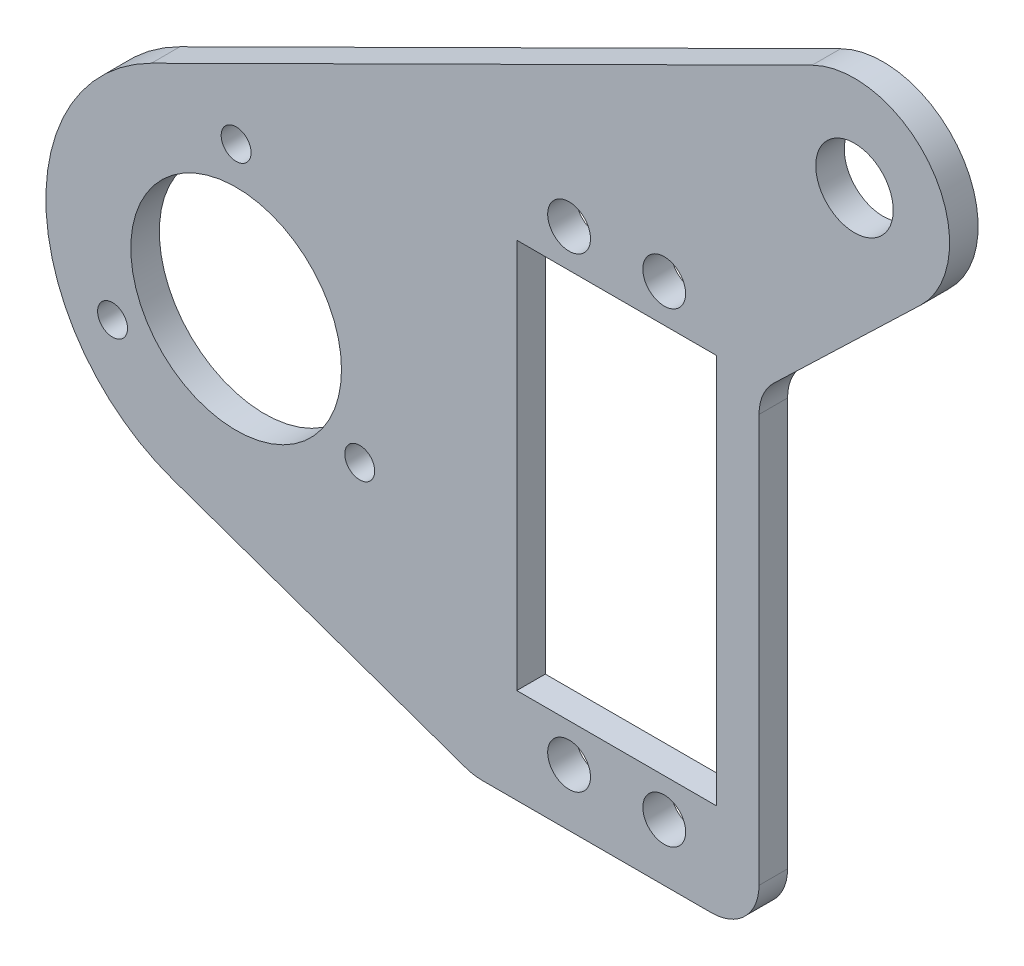
ISO-10303-21;
HEADER;
FILE_DESCRIPTION(('STEP AP214'),'2;1');
FILE_NAME('part.step','',(''),(''),'','','');
FILE_SCHEMA(('AUTOMOTIVE_DESIGN { 1 0 10303 214 1 1 1 1 }'));
ENDSEC;
DATA;
#1=APPLICATION_CONTEXT('core data for automotive mechanical design processes');
#2=APPLICATION_PROTOCOL_DEFINITION('international standard','automotive_design',2000,#1);
#3=PRODUCT_CONTEXT('',#1,'mechanical');
#4=PRODUCT('Part','Part','',(#3));
#5=PRODUCT_RELATED_PRODUCT_CATEGORY('part','',(#4));
#6=PRODUCT_DEFINITION_FORMATION('','',#4);
#7=PRODUCT_DEFINITION_CONTEXT('part definition',#1,'design');
#8=PRODUCT_DEFINITION('design','',#6,#7);
#9=PRODUCT_DEFINITION_SHAPE('','',#8);
#10=(LENGTH_UNIT() NAMED_UNIT(*) SI_UNIT(.MILLI.,.METRE.));
#11=(NAMED_UNIT(*) PLANE_ANGLE_UNIT() SI_UNIT($,.RADIAN.));
#12=(NAMED_UNIT(*) SI_UNIT($,.STERADIAN.) SOLID_ANGLE_UNIT());
#13=UNCERTAINTY_MEASURE_WITH_UNIT(LENGTH_MEASURE(1.E-05),#10,'distance_accuracy_value','');
#14=(GEOMETRIC_REPRESENTATION_CONTEXT(3) GLOBAL_UNCERTAINTY_ASSIGNED_CONTEXT((#13)) GLOBAL_UNIT_ASSIGNED_CONTEXT((#10,
#11,#12)) REPRESENTATION_CONTEXT('',''));
#15=CARTESIAN_POINT('',(0.,0.,0.));
#16=DIRECTION('',(0.,0.,1.));
#17=DIRECTION('',(1.,0.,0.));
#18=AXIS2_PLACEMENT_3D('',#15,#16,#17);
#19=CARTESIAN_POINT('',(65.,43.5,3.));
#20=DIRECTION('',(0.,0.,1.));
#21=DIRECTION('',(1.,0.,0.));
#22=AXIS2_PLACEMENT_3D('',#19,#20,#21);
#23=PLANE('',#22);
#24=CARTESIAN_POINT('',(45.,-24.,3.));
#25=DIRECTION('',(0.,0.,-1.));
#26=DIRECTION('',(-1.,0.,0.));
#27=AXIS2_PLACEMENT_3D('',#24,#25,#26);
#28=CIRCLE('',#27,2.25);
#29=CARTESIAN_POINT('',(42.75,-24.,3.));
#30=VERTEX_POINT('',#29);
#31=EDGE_CURVE('E167',#30,#30,#28,.T.);
#32=ORIENTED_EDGE('',*,*,#31,.T.);
#33=EDGE_LOOP('',(#32));
#34=FACE_BOUND('',#33,.T.);
#35=CARTESIAN_POINT('',(35.,25.,3.));
#36=DIRECTION('',(0.,0.,1.));
#37=DIRECTION('',(1.,0.,0.));
#38=AXIS2_PLACEMENT_3D('',#35,#36,#37);
#39=CIRCLE('',#38,2.24999999999999);
#40=CARTESIAN_POINT('',(37.25,25.,3.));
#41=VERTEX_POINT('',#40);
#42=EDGE_CURVE('E194',#41,#41,#39,.T.);
#43=ORIENTED_EDGE('',*,*,#42,.F.);
#44=EDGE_LOOP('',(#43));
#45=FACE_BOUND('',#44,.T.);
#46=CARTESIAN_POINT('',(45.,25.,3.));
#47=DIRECTION('',(0.,0.,-1.));
#48=DIRECTION('',(-1.,0.,0.));
#49=AXIS2_PLACEMENT_3D('',#46,#47,#48);
#50=CIRCLE('',#49,2.24999999999997);
#51=CARTESIAN_POINT('',(42.75,25.,3.));
#52=VERTEX_POINT('',#51);
#53=EDGE_CURVE('E198',#52,#52,#50,.T.);
#54=ORIENTED_EDGE('',*,*,#53,.T.);
#55=EDGE_LOOP('',(#54));
#56=FACE_BOUND('',#55,.T.);
#57=CARTESIAN_POINT('',(0.,15.,3.));
#58=DIRECTION('',(0.,0.,1.));
#59=DIRECTION('',(1.,0.,0.));
#60=AXIS2_PLACEMENT_3D('',#57,#58,#59);
#61=CIRCLE('',#60,1.575);
#62=CARTESIAN_POINT('',(1.575,15.,3.));
#63=VERTEX_POINT('',#62);
#64=EDGE_CURVE('E214',#63,#63,#61,.T.);
#65=ORIENTED_EDGE('',*,*,#64,.F.);
#66=EDGE_LOOP('',(#65));
#67=FACE_BOUND('',#66,.T.);
#68=CARTESIAN_POINT('',(12.9903810567675,-7.49999999999945,3.));
#69=DIRECTION('',(0.,0.,1.));
#70=DIRECTION('',(1.,0.,0.));
#71=AXIS2_PLACEMENT_3D('',#68,#69,#70);
#72=CIRCLE('',#71,1.575);
#73=CARTESIAN_POINT('',(14.5653810567675,-7.49999999999945,3.));
#74=VERTEX_POINT('',#73);
#75=EDGE_CURVE('E220',#74,#74,#72,.T.);
#76=ORIENTED_EDGE('',*,*,#75,.F.);
#77=EDGE_LOOP('',(#76));
#78=FACE_BOUND('',#77,.T.);
#79=CARTESIAN_POINT('',(-12.9903810567656,-7.50000000000055,3.));
#80=DIRECTION('',(0.,0.,1.));
#81=DIRECTION('',(1.,0.,0.));
#82=AXIS2_PLACEMENT_3D('',#79,#80,#81);
#83=CIRCLE('',#82,1.575);
#84=CARTESIAN_POINT('',(-11.4153810567656,-7.50000000000055,3.));
#85=VERTEX_POINT('',#84);
#86=EDGE_CURVE('E225',#85,#85,#83,.T.);
#87=ORIENTED_EDGE('',*,*,#86,.F.);
#88=EDGE_LOOP('',(#87));
#89=FACE_BOUND('',#88,.T.);
#90=CARTESIAN_POINT('',(0.,0.,3.));
#91=DIRECTION('',(0.,0.,1.));
#92=DIRECTION('',(1.,0.,0.));
#93=AXIS2_PLACEMENT_3D('',#90,#91,#92);
#94=CIRCLE('',#93,11.075);
#95=CARTESIAN_POINT('',(11.075,0.,3.));
#96=VERTEX_POINT('',#95);
#97=EDGE_CURVE('E234',#96,#96,#94,.T.);
#98=ORIENTED_EDGE('',*,*,#97,.F.);
#99=EDGE_LOOP('',(#98));
#100=FACE_BOUND('',#99,.T.);
#101=DIRECTION('',(1.,0.,0.));
#102=VECTOR('',#101,1.);
#103=CARTESIAN_POINT('',(24.9649735100306,-30.,3.));
#104=LINE('',#103,#102);
#105=CARTESIAN_POINT('',(25.8199682183297,-30.,3.));
#106=VERTEX_POINT('',#105);
#107=CARTESIAN_POINT('',(49.9649735100306,-30.,3.));
#108=VERTEX_POINT('',#107);
#109=EDGE_CURVE('E341',#106,#108,#104,.T.);
#110=ORIENTED_EDGE('',*,*,#109,.T.);
#111=CARTESIAN_POINT('',(49.9649735100306,-25.,3.));
#112=DIRECTION('',(0.,0.,1.));
#113=DIRECTION('',(1.,0.,0.));
#114=AXIS2_PLACEMENT_3D('',#111,#112,#113);
#115=CIRCLE('',#114,5.);
#116=CARTESIAN_POINT('',(54.9649735100306,-25.,3.));
#117=VERTEX_POINT('',#116);
#118=EDGE_CURVE('E283',#108,#117,#115,.T.);
#119=ORIENTED_EDGE('',*,*,#118,.T.);
#120=DIRECTION('',(0.,1.,0.));
#121=VECTOR('',#120,1.);
#122=CARTESIAN_POINT('',(54.9649735100306,-30.,3.));
#123=LINE('',#122,#121);
#124=CARTESIAN_POINT('',(54.9649735100306,17.8692908734532,3.));
#125=VERTEX_POINT('',#124);
#126=EDGE_CURVE('E247',#117,#125,#123,.T.);
#127=ORIENTED_EDGE('',*,*,#126,.T.);
#128=CARTESIAN_POINT('',(59.9649735100306,17.8692908734532,3.));
#129=DIRECTION('',(0.,0.,1.));
#130=DIRECTION('',(1.,0.,0.));
#131=AXIS2_PLACEMENT_3D('',#128,#129,#130);
#132=CIRCLE('',#131,5.);
#133=CARTESIAN_POINT('',(56.5018501060272,21.4757817286536,3.));
#134=VERTEX_POINT('',#133);
#135=EDGE_CURVE('E295',#125,#134,#132,.F.);
#136=ORIENTED_EDGE('',*,*,#135,.T.);
#137=DIRECTION('',(0.721298171040063,0.692624680800691,0.));
#138=VECTOR('',#137,1.);
#139=CARTESIAN_POINT('',(54.9649735100306,20.,3.));
#140=LINE('',#139,#138);
#141=CARTESIAN_POINT('',(71.9262468080069,36.2870182895994,3.));
#142=VERTEX_POINT('',#141);
#143=EDGE_CURVE('E252',#134,#142,#140,.T.);
#144=ORIENTED_EDGE('',*,*,#143,.T.);
#145=CARTESIAN_POINT('',(65.,43.5,3.));
#146=DIRECTION('',(0.,0.,1.));
#147=DIRECTION('',(1.,0.,0.));
#148=AXIS2_PLACEMENT_3D('',#145,#146,#147);
#149=CIRCLE('',#148,9.99999999999999);
#150=CARTESIAN_POINT('',(60.5464699258327,52.4535506855374,3.));
#151=VERTEX_POINT('',#150);
#152=EDGE_CURVE('E263',#142,#151,#149,.T.);
#153=ORIENTED_EDGE('',*,*,#152,.T.);
#154=DIRECTION('',(-0.895355068553739,-0.445353007416733,0.));
#155=VECTOR('',#154,1.);
#156=CARTESIAN_POINT('',(60.5464699258327,52.4535506855374,3.));
#157=LINE('',#156,#155);
#158=CARTESIAN_POINT('',(-8.90706014833466,17.9071013710748,3.));
#159=VERTEX_POINT('',#158);
#160=EDGE_CURVE('E266',#151,#159,#157,.T.);
#161=ORIENTED_EDGE('',*,*,#160,.T.);
#162=CARTESIAN_POINT('',(0.,0.,3.));
#163=DIRECTION('',(0.,0.,1.));
#164=DIRECTION('',(1.,0.,0.));
#165=AXIS2_PLACEMENT_3D('',#162,#163,#164);
#166=CIRCLE('',#165,20.);
#167=CARTESIAN_POINT('',(-6.64563505708417,-18.8636034385812,3.));
#168=VERTEX_POINT('',#167);
#169=EDGE_CURVE('E270',#159,#168,#166,.T.);
#170=ORIENTED_EDGE('',*,*,#169,.T.);
#171=DIRECTION('',(0.943180171929062,-0.332281752854208,0.));
#172=VECTOR('',#171,1.);
#173=CARTESIAN_POINT('',(24.9649735100306,-30.,3.));
#174=LINE('',#173,#172);
#175=CARTESIAN_POINT('',(24.1585594540587,-29.7159008596453,3.));
#176=VERTEX_POINT('',#175);
#177=EDGE_CURVE('E274',#168,#176,#174,.T.);
#178=ORIENTED_EDGE('',*,*,#177,.T.);
#179=CARTESIAN_POINT('',(25.8199682183297,-25.,3.));
#180=DIRECTION('',(0.,0.,1.));
#181=DIRECTION('',(1.,0.,0.));
#182=AXIS2_PLACEMENT_3D('',#179,#180,#181);
#183=CIRCLE('',#182,5.);
#184=EDGE_CURVE('E279',#176,#106,#183,.T.);
#185=ORIENTED_EDGE('',*,*,#184,.T.);
#186=EDGE_LOOP('',(#110,#119,#127,#136,#144,#153,#161,#170,#178,#185));
#187=FACE_BOUND('',#186,.T.);
#188=CARTESIAN_POINT('',(65.,43.5,3.));
#189=DIRECTION('',(0.,0.,1.));
#190=DIRECTION('',(1.,0.,0.));
#191=AXIS2_PLACEMENT_3D('',#188,#189,#190);
#192=CIRCLE('',#191,4.075);
#193=CARTESIAN_POINT('',(69.075,43.5,3.));
#194=VERTEX_POINT('',#193);
#195=EDGE_CURVE('E246',#194,#194,#192,.T.);
#196=ORIENTED_EDGE('',*,*,#195,.F.);
#197=EDGE_LOOP('',(#196));
#198=FACE_BOUND('',#197,.T.);
#199=CARTESIAN_POINT('',(35.,-24.,3.));
#200=DIRECTION('',(0.,0.,1.));
#201=DIRECTION('',(1.,0.,0.));
#202=AXIS2_PLACEMENT_3D('',#199,#200,#201);
#203=CIRCLE('',#202,2.25000000000001);
#204=CARTESIAN_POINT('',(37.25,-24.,3.));
#205=VERTEX_POINT('',#204);
#206=EDGE_CURVE('E199',#205,#205,#203,.T.);
#207=ORIENTED_EDGE('',*,*,#206,.F.);
#208=EDGE_LOOP('',(#207));
#209=FACE_BOUND('',#208,.T.);
#210=DIRECTION('',(-1.,0.,0.));
#211=VECTOR('',#210,1.);
#212=CARTESIAN_POINT('',(29.5,21.,3.));
#213=LINE('',#212,#211);
#214=CARTESIAN_POINT('',(50.5,21.,3.));
#215=VERTEX_POINT('',#214);
#216=CARTESIAN_POINT('',(29.5,21.,3.));
#217=VERTEX_POINT('',#216);
#218=EDGE_CURVE('E159',#215,#217,#213,.T.);
#219=ORIENTED_EDGE('',*,*,#218,.F.);
#220=DIRECTION('',(0.,1.,0.));
#221=VECTOR('',#220,1.);
#222=CARTESIAN_POINT('',(50.5,-20.,3.));
#223=LINE('',#222,#221);
#224=CARTESIAN_POINT('',(50.5,-20.,3.));
#225=VERTEX_POINT('',#224);
#226=EDGE_CURVE('E150',#225,#215,#223,.T.);
#227=ORIENTED_EDGE('',*,*,#226,.F.);
#228=DIRECTION('',(1.,0.,0.));
#229=VECTOR('',#228,1.);
#230=CARTESIAN_POINT('',(29.5,-20.,3.));
#231=LINE('',#230,#229);
#232=CARTESIAN_POINT('',(29.5,-20.,3.));
#233=VERTEX_POINT('',#232);
#234=EDGE_CURVE('E175',#233,#225,#231,.T.);
#235=ORIENTED_EDGE('',*,*,#234,.F.);
#236=DIRECTION('',(0.,-1.,0.));
#237=VECTOR('',#236,1.);
#238=CARTESIAN_POINT('',(29.5,-20.,3.));
#239=LINE('',#238,#237);
#240=EDGE_CURVE('E171',#217,#233,#239,.T.);
#241=ORIENTED_EDGE('',*,*,#240,.F.);
#242=EDGE_LOOP('',(#219,#227,#235,#241));
#243=FACE_BOUND('',#242,.T.);
#244=ADVANCED_FACE('F50',(#34,#45,#56,#67,#78,#89,#100,#187,#198,#209,#243),#23,.T.);
#245=CARTESIAN_POINT('',(65.,43.5,0.));
#246=DIRECTION('',(0.,0.,1.));
#247=DIRECTION('',(1.,0.,0.));
#248=AXIS2_PLACEMENT_3D('',#245,#246,#247);
#249=PLANE('',#248);
#250=CARTESIAN_POINT('',(35.,-24.,0.));
#251=DIRECTION('',(0.,0.,1.));
#252=DIRECTION('',(1.,0.,0.));
#253=AXIS2_PLACEMENT_3D('',#250,#251,#252);
#254=CIRCLE('',#253,2.25000000000001);
#255=CARTESIAN_POINT('',(37.25,-24.,0.));
#256=VERTEX_POINT('',#255);
#257=EDGE_CURVE('E390',#256,#256,#254,.F.);
#258=ORIENTED_EDGE('',*,*,#257,.F.);
#259=EDGE_LOOP('',(#258));
#260=FACE_BOUND('',#259,.T.);
#261=CARTESIAN_POINT('',(35.,25.,0.));
#262=DIRECTION('',(0.,0.,1.));
#263=DIRECTION('',(1.,0.,0.));
#264=AXIS2_PLACEMENT_3D('',#261,#262,#263);
#265=CIRCLE('',#264,2.24999999999999);
#266=CARTESIAN_POINT('',(37.25,25.,0.));
#267=VERTEX_POINT('',#266);
#268=EDGE_CURVE('E394',#267,#267,#265,.F.);
#269=ORIENTED_EDGE('',*,*,#268,.F.);
#270=EDGE_LOOP('',(#269));
#271=FACE_BOUND('',#270,.T.);
#272=CARTESIAN_POINT('',(65.,43.5,0.));
#273=DIRECTION('',(0.,0.,1.));
#274=DIRECTION('',(1.,0.,0.));
#275=AXIS2_PLACEMENT_3D('',#272,#273,#274);
#276=CIRCLE('',#275,4.075);
#277=CARTESIAN_POINT('',(69.075,43.5,0.));
#278=VERTEX_POINT('',#277);
#279=EDGE_CURVE('E242',#278,#278,#276,.T.);
#280=ORIENTED_EDGE('',*,*,#279,.T.);
#281=EDGE_LOOP('',(#280));
#282=FACE_BOUND('',#281,.T.);
#283=CARTESIAN_POINT('',(0.,0.,0.));
#284=DIRECTION('',(0.,0.,1.));
#285=DIRECTION('',(1.,0.,0.));
#286=AXIS2_PLACEMENT_3D('',#283,#284,#285);
#287=CIRCLE('',#286,11.075);
#288=CARTESIAN_POINT('',(11.075,0.,0.));
#289=VERTEX_POINT('',#288);
#290=EDGE_CURVE('E241',#289,#289,#287,.T.);
#291=ORIENTED_EDGE('',*,*,#290,.T.);
#292=EDGE_LOOP('',(#291));
#293=FACE_BOUND('',#292,.T.);
#294=DIRECTION('',(0.,1.,0.));
#295=VECTOR('',#294,1.);
#296=CARTESIAN_POINT('',(54.9649735100306,-30.,0.));
#297=LINE('',#296,#295);
#298=CARTESIAN_POINT('',(54.9649735100306,-25.,0.));
#299=VERTEX_POINT('',#298);
#300=CARTESIAN_POINT('',(54.9649735100306,17.8692908734532,0.));
#301=VERTEX_POINT('',#300);
#302=EDGE_CURVE('E240',#299,#301,#297,.T.);
#303=ORIENTED_EDGE('',*,*,#302,.F.);
#304=CARTESIAN_POINT('',(49.9649735100306,-25.,0.));
#305=DIRECTION('',(0.,0.,1.));
#306=DIRECTION('',(1.,0.,0.));
#307=AXIS2_PLACEMENT_3D('',#304,#305,#306);
#308=CIRCLE('',#307,5.);
#309=CARTESIAN_POINT('',(49.9649735100306,-30.,0.));
#310=VERTEX_POINT('',#309);
#311=EDGE_CURVE('E309',#299,#310,#308,.F.);
#312=ORIENTED_EDGE('',*,*,#311,.T.);
#313=DIRECTION('',(1.,0.,0.));
#314=VECTOR('',#313,1.);
#315=CARTESIAN_POINT('',(24.9649735100306,-30.,0.));
#316=LINE('',#315,#314);
#317=CARTESIAN_POINT('',(25.8199682183297,-30.,0.));
#318=VERTEX_POINT('',#317);
#319=EDGE_CURVE('E253',#318,#310,#316,.T.);
#320=ORIENTED_EDGE('',*,*,#319,.F.);
#321=CARTESIAN_POINT('',(25.8199682183297,-25.,0.));
#322=DIRECTION('',(0.,0.,1.));
#323=DIRECTION('',(1.,0.,0.));
#324=AXIS2_PLACEMENT_3D('',#321,#322,#323);
#325=CIRCLE('',#324,5.);
#326=CARTESIAN_POINT('',(24.1585594540587,-29.7159008596453,0.));
#327=VERTEX_POINT('',#326);
#328=EDGE_CURVE('E311',#318,#327,#325,.F.);
#329=ORIENTED_EDGE('',*,*,#328,.T.);
#330=DIRECTION('',(0.943180171929062,-0.332281752854208,0.));
#331=VECTOR('',#330,1.);
#332=CARTESIAN_POINT('',(24.9649735100306,-30.,0.));
#333=LINE('',#332,#331);
#334=CARTESIAN_POINT('',(-6.64563505708417,-18.8636034385812,0.));
#335=VERTEX_POINT('',#334);
#336=EDGE_CURVE('E350',#335,#327,#333,.T.);
#337=ORIENTED_EDGE('',*,*,#336,.F.);
#338=CARTESIAN_POINT('',(0.,0.,0.));
#339=DIRECTION('',(0.,0.,1.));
#340=DIRECTION('',(1.,0.,0.));
#341=AXIS2_PLACEMENT_3D('',#338,#339,#340);
#342=CIRCLE('',#341,20.);
#343=CARTESIAN_POINT('',(-8.90706014833466,17.9071013710748,0.));
#344=VERTEX_POINT('',#343);
#345=EDGE_CURVE('E354',#344,#335,#342,.T.);
#346=ORIENTED_EDGE('',*,*,#345,.F.);
#347=DIRECTION('',(-0.895355068553739,-0.445353007416733,0.));
#348=VECTOR('',#347,1.);
#349=CARTESIAN_POINT('',(60.5464699258327,52.4535506855374,0.));
#350=LINE('',#349,#348);
#351=CARTESIAN_POINT('',(60.5464699258327,52.4535506855374,0.));
#352=VERTEX_POINT('',#351);
#353=EDGE_CURVE('E357',#352,#344,#350,.T.);
#354=ORIENTED_EDGE('',*,*,#353,.F.);
#355=CARTESIAN_POINT('',(65.,43.5,0.));
#356=DIRECTION('',(0.,0.,1.));
#357=DIRECTION('',(1.,0.,0.));
#358=AXIS2_PLACEMENT_3D('',#355,#356,#357);
#359=CIRCLE('',#358,9.99999999999999);
#360=CARTESIAN_POINT('',(71.9262468080069,36.2870182895994,0.));
#361=VERTEX_POINT('',#360);
#362=EDGE_CURVE('E360',#361,#352,#359,.T.);
#363=ORIENTED_EDGE('',*,*,#362,.F.);
#364=DIRECTION('',(0.721298171040063,0.692624680800691,0.));
#365=VECTOR('',#364,1.);
#366=CARTESIAN_POINT('',(54.9649735100306,20.,0.));
#367=LINE('',#366,#365);
#368=CARTESIAN_POINT('',(56.5018501060272,21.4757817286536,0.));
#369=VERTEX_POINT('',#368);
#370=EDGE_CURVE('E363',#369,#361,#367,.T.);
#371=ORIENTED_EDGE('',*,*,#370,.F.);
#372=CARTESIAN_POINT('',(59.9649735100306,17.8692908734532,0.));
#373=DIRECTION('',(0.,0.,1.));
#374=DIRECTION('',(1.,0.,0.));
#375=AXIS2_PLACEMENT_3D('',#372,#373,#374);
#376=CIRCLE('',#375,5.);
#377=EDGE_CURVE('E292',#369,#301,#376,.T.);
#378=ORIENTED_EDGE('',*,*,#377,.T.);
#379=EDGE_LOOP('',(#303,#312,#320,#329,#337,#346,#354,#363,#371,#378));
#380=FACE_BOUND('',#379,.T.);
#381=CARTESIAN_POINT('',(-12.9903810567656,-7.50000000000055,0.));
#382=DIRECTION('',(0.,0.,1.));
#383=DIRECTION('',(1.,0.,0.));
#384=AXIS2_PLACEMENT_3D('',#381,#382,#383);
#385=CIRCLE('',#384,1.575);
#386=CARTESIAN_POINT('',(-11.4153810567656,-7.50000000000055,0.));
#387=VERTEX_POINT('',#386);
#388=EDGE_CURVE('E219',#387,#387,#385,.F.);
#389=ORIENTED_EDGE('',*,*,#388,.F.);
#390=EDGE_LOOP('',(#389));
#391=FACE_BOUND('',#390,.T.);
#392=CARTESIAN_POINT('',(12.9903810567675,-7.49999999999945,0.));
#393=DIRECTION('',(0.,0.,1.));
#394=DIRECTION('',(1.,0.,0.));
#395=AXIS2_PLACEMENT_3D('',#392,#393,#394);
#396=CIRCLE('',#395,1.575);
#397=CARTESIAN_POINT('',(14.5653810567675,-7.49999999999945,0.));
#398=VERTEX_POINT('',#397);
#399=EDGE_CURVE('E377',#398,#398,#396,.F.);
#400=ORIENTED_EDGE('',*,*,#399,.F.);
#401=EDGE_LOOP('',(#400));
#402=FACE_BOUND('',#401,.T.);
#403=CARTESIAN_POINT('',(0.,15.,0.));
#404=DIRECTION('',(0.,0.,1.));
#405=DIRECTION('',(1.,0.,0.));
#406=AXIS2_PLACEMENT_3D('',#403,#404,#405);
#407=CIRCLE('',#406,1.575);
#408=CARTESIAN_POINT('',(1.575,15.,0.));
#409=VERTEX_POINT('',#408);
#410=EDGE_CURVE('E374',#409,#409,#407,.F.);
#411=ORIENTED_EDGE('',*,*,#410,.F.);
#412=EDGE_LOOP('',(#411));
#413=FACE_BOUND('',#412,.T.);
#414=CARTESIAN_POINT('',(45.,25.,0.));
#415=DIRECTION('',(0.,0.,1.));
#416=DIRECTION('',(1.,0.,0.));
#417=AXIS2_PLACEMENT_3D('',#414,#415,#416);
#418=CIRCLE('',#417,2.24999999999997);
#419=CARTESIAN_POINT('',(47.25,25.,0.));
#420=VERTEX_POINT('',#419);
#421=EDGE_CURVE('E212',#420,#420,#418,.T.);
#422=ORIENTED_EDGE('',*,*,#421,.T.);
#423=EDGE_LOOP('',(#422));
#424=FACE_BOUND('',#423,.T.);
#425=CARTESIAN_POINT('',(45.,-24.,0.));
#426=DIRECTION('',(0.,0.,1.));
#427=DIRECTION('',(1.,0.,0.));
#428=AXIS2_PLACEMENT_3D('',#425,#426,#427);
#429=CIRCLE('',#428,2.25);
#430=CARTESIAN_POINT('',(47.25,-24.,0.));
#431=VERTEX_POINT('',#430);
#432=EDGE_CURVE('E387',#431,#431,#429,.T.);
#433=ORIENTED_EDGE('',*,*,#432,.T.);
#434=EDGE_LOOP('',(#433));
#435=FACE_BOUND('',#434,.T.);
#436=DIRECTION('',(0.,-1.,0.));
#437=VECTOR('',#436,1.);
#438=CARTESIAN_POINT('',(50.5,43.5,0.));
#439=LINE('',#438,#437);
#440=CARTESIAN_POINT('',(50.5,21.,0.));
#441=VERTEX_POINT('',#440);
#442=CARTESIAN_POINT('',(50.5,-20.,0.));
#443=VERTEX_POINT('',#442);
#444=EDGE_CURVE('E12',#441,#443,#439,.T.);
#445=ORIENTED_EDGE('',*,*,#444,.F.);
#446=DIRECTION('',(1.,0.,0.));
#447=VECTOR('',#446,1.);
#448=CARTESIAN_POINT('',(65.,21.,0.));
#449=LINE('',#448,#447);
#450=CARTESIAN_POINT('',(29.5,21.,0.));
#451=VERTEX_POINT('',#450);
#452=EDGE_CURVE('E59',#451,#441,#449,.T.);
#453=ORIENTED_EDGE('',*,*,#452,.F.);
#454=DIRECTION('',(0.,1.,0.));
#455=VECTOR('',#454,1.);
#456=CARTESIAN_POINT('',(29.5,43.5,0.));
#457=LINE('',#456,#455);
#458=CARTESIAN_POINT('',(29.5,-20.,0.));
#459=VERTEX_POINT('',#458);
#460=EDGE_CURVE('E301',#459,#451,#457,.T.);
#461=ORIENTED_EDGE('',*,*,#460,.F.);
#462=DIRECTION('',(-1.,0.,0.));
#463=VECTOR('',#462,1.);
#464=CARTESIAN_POINT('',(65.,-20.,0.));
#465=LINE('',#464,#463);
#466=EDGE_CURVE('E298',#443,#459,#465,.T.);
#467=ORIENTED_EDGE('',*,*,#466,.F.);
#468=EDGE_LOOP('',(#445,#453,#461,#467));
#469=FACE_BOUND('',#468,.T.);
#470=ADVANCED_FACE('F417',(#260,#271,#282,#293,#380,#391,#402,#413,#424,#435,#469),#249,.F.);
#471=CARTESIAN_POINT('',(54.9649735100306,-30.,3.));
#472=DIRECTION('',(-1.,0.,0.));
#473=DIRECTION('',(0.,0.,1.));
#474=AXIS2_PLACEMENT_3D('',#471,#472,#473);
#475=PLANE('',#474);
#476=ORIENTED_EDGE('',*,*,#302,.T.);
#477=DIRECTION('',(0.,0.,-1.));
#478=VECTOR('',#477,1.);
#479=CARTESIAN_POINT('',(54.9649735100306,17.8692908734532,3.));
#480=LINE('',#479,#478);
#481=EDGE_CURVE('E314',#301,#125,#480,.F.);
#482=ORIENTED_EDGE('',*,*,#481,.T.);
#483=ORIENTED_EDGE('',*,*,#126,.F.);
#484=DIRECTION('',(0.,0.,-1.));
#485=VECTOR('',#484,1.);
#486=CARTESIAN_POINT('',(54.9649735100306,-25.,3.));
#487=LINE('',#486,#485);
#488=EDGE_CURVE('E317',#117,#299,#487,.T.);
#489=ORIENTED_EDGE('',*,*,#488,.T.);
#490=EDGE_LOOP('',(#476,#482,#483,#489));
#491=FACE_BOUND('',#490,.T.);
#492=ADVANCED_FACE('F420',(#491),#475,.F.);
#493=CARTESIAN_POINT('',(54.9649735100306,20.,3.));
#494=DIRECTION('',(-0.692624680800691,0.721298171040063,0.));
#495=DIRECTION('',(-0.721298171040063,-0.692624680800691,0.));
#496=AXIS2_PLACEMENT_3D('',#493,#494,#495);
#497=PLANE('',#496);
#498=ORIENTED_EDGE('',*,*,#143,.F.);
#499=DIRECTION('',(0.,0.,-1.));
#500=VECTOR('',#499,1.);
#501=CARTESIAN_POINT('',(56.5018501060272,21.4757817286536,0.));
#502=LINE('',#501,#500);
#503=EDGE_CURVE('E321',#134,#369,#502,.T.);
#504=ORIENTED_EDGE('',*,*,#503,.T.);
#505=ORIENTED_EDGE('',*,*,#370,.T.);
#506=DIRECTION('',(0.,0.,-1.));
#507=VECTOR('',#506,1.);
#508=CARTESIAN_POINT('',(71.9262468080069,36.2870182895994,3.));
#509=LINE('',#508,#507);
#510=EDGE_CURVE('E325',#142,#361,#509,.T.);
#511=ORIENTED_EDGE('',*,*,#510,.F.);
#512=EDGE_LOOP('',(#498,#504,#505,#511));
#513=FACE_BOUND('',#512,.T.);
#514=ADVANCED_FACE('F464',(#513),#497,.F.);
#515=CARTESIAN_POINT('',(65.,43.5,3.));
#516=DIRECTION('',(0.,0.,-1.));
#517=DIRECTION('',(-1.,0.,0.));
#518=AXIS2_PLACEMENT_3D('',#515,#516,#517);
#519=CYLINDRICAL_SURFACE('',#518,9.99999999999999);
#520=ORIENTED_EDGE('',*,*,#362,.T.);
#521=DIRECTION('',(0.,0.,-1.));
#522=VECTOR('',#521,1.);
#523=CARTESIAN_POINT('',(60.5464699258327,52.4535506855374,3.));
#524=LINE('',#523,#522);
#525=EDGE_CURVE('E329',#151,#352,#524,.T.);
#526=ORIENTED_EDGE('',*,*,#525,.F.);
#527=ORIENTED_EDGE('',*,*,#152,.F.);
#528=ORIENTED_EDGE('',*,*,#510,.T.);
#529=EDGE_LOOP('',(#520,#526,#527,#528));
#530=FACE_BOUND('',#529,.T.);
#531=ADVANCED_FACE('F460',(#530),#519,.T.);
#532=CARTESIAN_POINT('',(60.5464699258327,52.4535506855374,3.));
#533=DIRECTION('',(0.445353007416733,-0.895355068553739,0.));
#534=DIRECTION('',(0.895355068553739,0.445353007416733,0.));
#535=AXIS2_PLACEMENT_3D('',#532,#533,#534);
#536=PLANE('',#535);
#537=ORIENTED_EDGE('',*,*,#353,.T.);
#538=DIRECTION('',(0.,0.,-1.));
#539=VECTOR('',#538,1.);
#540=CARTESIAN_POINT('',(-8.90706014833466,17.9071013710748,3.));
#541=LINE('',#540,#539);
#542=EDGE_CURVE('E333',#159,#344,#541,.T.);
#543=ORIENTED_EDGE('',*,*,#542,.F.);
#544=ORIENTED_EDGE('',*,*,#160,.F.);
#545=ORIENTED_EDGE('',*,*,#525,.T.);
#546=EDGE_LOOP('',(#537,#543,#544,#545));
#547=FACE_BOUND('',#546,.T.);
#548=ADVANCED_FACE('F456',(#547),#536,.F.);
#549=CARTESIAN_POINT('',(0.,0.,3.));
#550=DIRECTION('',(0.,0.,-1.));
#551=DIRECTION('',(-1.,0.,0.));
#552=AXIS2_PLACEMENT_3D('',#549,#550,#551);
#553=CYLINDRICAL_SURFACE('',#552,20.);
#554=ORIENTED_EDGE('',*,*,#345,.T.);
#555=DIRECTION('',(0.,0.,-1.));
#556=VECTOR('',#555,1.);
#557=CARTESIAN_POINT('',(-6.64563505708417,-18.8636034385812,3.));
#558=LINE('',#557,#556);
#559=EDGE_CURVE('E337',#168,#335,#558,.T.);
#560=ORIENTED_EDGE('',*,*,#559,.F.);
#561=ORIENTED_EDGE('',*,*,#169,.F.);
#562=ORIENTED_EDGE('',*,*,#542,.T.);
#563=EDGE_LOOP('',(#554,#560,#561,#562));
#564=FACE_BOUND('',#563,.T.);
#565=ADVANCED_FACE('F452',(#564),#553,.T.);
#566=CARTESIAN_POINT('',(24.9649735100306,-30.,3.));
#567=DIRECTION('',(0.332281752854208,0.943180171929062,0.));
#568=DIRECTION('',(-0.943180171929062,0.332281752854208,0.));
#569=AXIS2_PLACEMENT_3D('',#566,#567,#568);
#570=PLANE('',#569);
#571=ORIENTED_EDGE('',*,*,#336,.T.);
#572=DIRECTION('',(0.,0.,-1.));
#573=VECTOR('',#572,1.);
#574=CARTESIAN_POINT('',(24.1585594540587,-29.7159008596453,3.));
#575=LINE('',#574,#573);
#576=EDGE_CURVE('E289',#327,#176,#575,.F.);
#577=ORIENTED_EDGE('',*,*,#576,.T.);
#578=ORIENTED_EDGE('',*,*,#177,.F.);
#579=ORIENTED_EDGE('',*,*,#559,.T.);
#580=EDGE_LOOP('',(#571,#577,#578,#579));
#581=FACE_BOUND('',#580,.T.);
#582=ADVANCED_FACE('F448',(#581),#570,.F.);
#583=CARTESIAN_POINT('',(24.9649735100306,-30.,3.));
#584=DIRECTION('',(0.,1.,0.));
#585=DIRECTION('',(0.,0.,1.));
#586=AXIS2_PLACEMENT_3D('',#583,#584,#585);
#587=PLANE('',#586);
#588=ORIENTED_EDGE('',*,*,#319,.T.);
#589=DIRECTION('',(0.,0.,-1.));
#590=VECTOR('',#589,1.);
#591=CARTESIAN_POINT('',(49.9649735100306,-30.,3.));
#592=LINE('',#591,#590);
#593=EDGE_CURVE('E284',#310,#108,#592,.F.);
#594=ORIENTED_EDGE('',*,*,#593,.T.);
#595=ORIENTED_EDGE('',*,*,#109,.F.);
#596=DIRECTION('',(0.,0.,-1.));
#597=VECTOR('',#596,1.);
#598=CARTESIAN_POINT('',(25.8199682183297,-30.,3.));
#599=LINE('',#598,#597);
#600=EDGE_CURVE('E306',#106,#318,#599,.T.);
#601=ORIENTED_EDGE('',*,*,#600,.T.);
#602=EDGE_LOOP('',(#588,#594,#595,#601));
#603=FACE_BOUND('',#602,.T.);
#604=ADVANCED_FACE('F445',(#603),#587,.F.);
#605=CARTESIAN_POINT('',(0.,0.,3.));
#606=DIRECTION('',(0.,0.,-1.));
#607=DIRECTION('',(-1.,0.,0.));
#608=AXIS2_PLACEMENT_3D('',#605,#606,#607);
#609=CYLINDRICAL_SURFACE('',#608,11.075);
#610=ORIENTED_EDGE('',*,*,#97,.T.);
#611=EDGE_LOOP('',(#610));
#612=FACE_BOUND('',#611,.T.);
#613=ORIENTED_EDGE('',*,*,#290,.F.);
#614=EDGE_LOOP('',(#613));
#615=FACE_BOUND('',#614,.T.);
#616=ADVANCED_FACE('F442',(#612,#615),#609,.F.);
#617=CARTESIAN_POINT('',(65.,43.5,3.));
#618=DIRECTION('',(0.,0.,-1.));
#619=DIRECTION('',(-1.,0.,0.));
#620=AXIS2_PLACEMENT_3D('',#617,#618,#619);
#621=CYLINDRICAL_SURFACE('',#620,4.075);
#622=ORIENTED_EDGE('',*,*,#195,.T.);
#623=EDGE_LOOP('',(#622));
#624=FACE_BOUND('',#623,.T.);
#625=ORIENTED_EDGE('',*,*,#279,.F.);
#626=EDGE_LOOP('',(#625));
#627=FACE_BOUND('',#626,.T.);
#628=ADVANCED_FACE('F543',(#624,#627),#621,.F.);
#629=CARTESIAN_POINT('',(-12.9903810567656,-7.50000000000055,3.));
#630=DIRECTION('',(0.,0.,-1.));
#631=DIRECTION('',(-1.,0.,0.));
#632=AXIS2_PLACEMENT_3D('',#629,#630,#631);
#633=CYLINDRICAL_SURFACE('',#632,1.575);
#634=ORIENTED_EDGE('',*,*,#86,.T.);
#635=EDGE_LOOP('',(#634));
#636=FACE_BOUND('',#635,.T.);
#637=ORIENTED_EDGE('',*,*,#388,.T.);
#638=EDGE_LOOP('',(#637));
#639=FACE_BOUND('',#638,.T.);
#640=ADVANCED_FACE('F540',(#636,#639),#633,.F.);
#641=CARTESIAN_POINT('',(12.9903810567675,-7.49999999999945,3.));
#642=DIRECTION('',(0.,0.,-1.));
#643=DIRECTION('',(-1.,0.,0.));
#644=AXIS2_PLACEMENT_3D('',#641,#642,#643);
#645=CYLINDRICAL_SURFACE('',#644,1.575);
#646=ORIENTED_EDGE('',*,*,#75,.T.);
#647=EDGE_LOOP('',(#646));
#648=FACE_BOUND('',#647,.T.);
#649=ORIENTED_EDGE('',*,*,#399,.T.);
#650=EDGE_LOOP('',(#649));
#651=FACE_BOUND('',#650,.T.);
#652=ADVANCED_FACE('F532',(#648,#651),#645,.F.);
#653=CARTESIAN_POINT('',(0.,15.,3.));
#654=DIRECTION('',(0.,0.,-1.));
#655=DIRECTION('',(-1.,0.,0.));
#656=AXIS2_PLACEMENT_3D('',#653,#654,#655);
#657=CYLINDRICAL_SURFACE('',#656,1.575);
#658=ORIENTED_EDGE('',*,*,#64,.T.);
#659=EDGE_LOOP('',(#658));
#660=FACE_BOUND('',#659,.T.);
#661=ORIENTED_EDGE('',*,*,#410,.T.);
#662=EDGE_LOOP('',(#661));
#663=FACE_BOUND('',#662,.T.);
#664=ADVANCED_FACE('F523',(#660,#663),#657,.F.);
#665=CARTESIAN_POINT('',(45.,25.,3.));
#666=DIRECTION('',(0.,0.,-1.));
#667=DIRECTION('',(-1.,0.,0.));
#668=AXIS2_PLACEMENT_3D('',#665,#666,#667);
#669=CYLINDRICAL_SURFACE('',#668,2.24999999999997);
#670=ORIENTED_EDGE('',*,*,#53,.F.);
#671=EDGE_LOOP('',(#670));
#672=FACE_BOUND('',#671,.T.);
#673=ORIENTED_EDGE('',*,*,#421,.F.);
#674=EDGE_LOOP('',(#673));
#675=FACE_BOUND('',#674,.T.);
#676=ADVANCED_FACE('F520',(#672,#675),#669,.F.);
#677=CARTESIAN_POINT('',(35.,25.,3.));
#678=DIRECTION('',(0.,0.,-1.));
#679=DIRECTION('',(-1.,0.,0.));
#680=AXIS2_PLACEMENT_3D('',#677,#678,#679);
#681=CYLINDRICAL_SURFACE('',#680,2.24999999999999);
#682=ORIENTED_EDGE('',*,*,#42,.T.);
#683=EDGE_LOOP('',(#682));
#684=FACE_BOUND('',#683,.T.);
#685=ORIENTED_EDGE('',*,*,#268,.T.);
#686=EDGE_LOOP('',(#685));
#687=FACE_BOUND('',#686,.T.);
#688=ADVANCED_FACE('F522',(#684,#687),#681,.F.);
#689=CARTESIAN_POINT('',(35.,-24.,3.));
#690=DIRECTION('',(0.,0.,-1.));
#691=DIRECTION('',(-1.,0.,0.));
#692=AXIS2_PLACEMENT_3D('',#689,#690,#691);
#693=CYLINDRICAL_SURFACE('',#692,2.25000000000001);
#694=ORIENTED_EDGE('',*,*,#206,.T.);
#695=EDGE_LOOP('',(#694));
#696=FACE_BOUND('',#695,.T.);
#697=ORIENTED_EDGE('',*,*,#257,.T.);
#698=EDGE_LOOP('',(#697));
#699=FACE_BOUND('',#698,.T.);
#700=ADVANCED_FACE('F413',(#696,#699),#693,.F.);
#701=CARTESIAN_POINT('',(45.,-24.,3.));
#702=DIRECTION('',(0.,0.,-1.));
#703=DIRECTION('',(-1.,0.,0.));
#704=AXIS2_PLACEMENT_3D('',#701,#702,#703);
#705=CYLINDRICAL_SURFACE('',#704,2.25);
#706=ORIENTED_EDGE('',*,*,#31,.F.);
#707=EDGE_LOOP('',(#706));
#708=FACE_BOUND('',#707,.T.);
#709=ORIENTED_EDGE('',*,*,#432,.F.);
#710=EDGE_LOOP('',(#709));
#711=FACE_BOUND('',#710,.T.);
#712=ADVANCED_FACE('F409',(#708,#711),#705,.F.);
#713=CARTESIAN_POINT('',(59.9649735100306,17.8692908734532,3.));
#714=DIRECTION('',(0.,0.,1.));
#715=DIRECTION('',(1.,0.,0.));
#716=AXIS2_PLACEMENT_3D('',#713,#714,#715);
#717=CYLINDRICAL_SURFACE('',#716,5.);
#718=ORIENTED_EDGE('',*,*,#135,.F.);
#719=ORIENTED_EDGE('',*,*,#481,.F.);
#720=ORIENTED_EDGE('',*,*,#377,.F.);
#721=ORIENTED_EDGE('',*,*,#503,.F.);
#722=EDGE_LOOP('',(#718,#719,#720,#721));
#723=FACE_BOUND('',#722,.T.);
#724=ADVANCED_FACE('F412',(#723),#717,.F.);
#725=CARTESIAN_POINT('',(49.9649735100306,-25.,3.));
#726=DIRECTION('',(0.,0.,-1.));
#727=DIRECTION('',(-1.,0.,0.));
#728=AXIS2_PLACEMENT_3D('',#725,#726,#727);
#729=CYLINDRICAL_SURFACE('',#728,5.);
#730=ORIENTED_EDGE('',*,*,#118,.F.);
#731=ORIENTED_EDGE('',*,*,#593,.F.);
#732=ORIENTED_EDGE('',*,*,#311,.F.);
#733=ORIENTED_EDGE('',*,*,#488,.F.);
#734=EDGE_LOOP('',(#730,#731,#732,#733));
#735=FACE_BOUND('',#734,.T.);
#736=ADVANCED_FACE('F473',(#735),#729,.T.);
#737=CARTESIAN_POINT('',(25.8199682183297,-25.,3.));
#738=DIRECTION('',(0.,0.,-1.));
#739=DIRECTION('',(-1.,0.,0.));
#740=AXIS2_PLACEMENT_3D('',#737,#738,#739);
#741=CYLINDRICAL_SURFACE('',#740,5.);
#742=ORIENTED_EDGE('',*,*,#184,.F.);
#743=ORIENTED_EDGE('',*,*,#576,.F.);
#744=ORIENTED_EDGE('',*,*,#328,.F.);
#745=ORIENTED_EDGE('',*,*,#600,.F.);
#746=EDGE_LOOP('',(#742,#743,#744,#745));
#747=FACE_BOUND('',#746,.T.);
#748=ADVANCED_FACE('F52',(#747),#741,.T.);
#749=CARTESIAN_POINT('',(50.5,-20.,3.));
#750=DIRECTION('',(-1.,0.,0.));
#751=DIRECTION('',(0.,0.,1.));
#752=AXIS2_PLACEMENT_3D('',#749,#750,#751);
#753=PLANE('',#752);
#754=ORIENTED_EDGE('',*,*,#444,.T.);
#755=DIRECTION('',(0.,0.,-1.));
#756=VECTOR('',#755,1.);
#757=CARTESIAN_POINT('',(50.5,-20.,3.));
#758=LINE('',#757,#756);
#759=EDGE_CURVE('E71',#225,#443,#758,.T.);
#760=ORIENTED_EDGE('',*,*,#759,.F.);
#761=ORIENTED_EDGE('',*,*,#226,.T.);
#762=DIRECTION('',(0.,0.,-1.));
#763=VECTOR('',#762,1.);
#764=CARTESIAN_POINT('',(50.5,21.,3.));
#765=LINE('',#764,#763);
#766=EDGE_CURVE('E153',#215,#441,#765,.T.);
#767=ORIENTED_EDGE('',*,*,#766,.T.);
#768=EDGE_LOOP('',(#754,#760,#761,#767));
#769=FACE_BOUND('',#768,.T.);
#770=ADVANCED_FACE('F152',(#769),#753,.T.);
#771=CARTESIAN_POINT('',(29.5,21.,3.));
#772=DIRECTION('',(0.,-1.,0.));
#773=DIRECTION('',(1.,0.,0.));
#774=AXIS2_PLACEMENT_3D('',#771,#772,#773);
#775=PLANE('',#774);
#776=ORIENTED_EDGE('',*,*,#452,.T.);
#777=ORIENTED_EDGE('',*,*,#766,.F.);
#778=ORIENTED_EDGE('',*,*,#218,.T.);
#779=DIRECTION('',(0.,0.,-1.));
#780=VECTOR('',#779,1.);
#781=CARTESIAN_POINT('',(29.5,21.,3.));
#782=LINE('',#781,#780);
#783=EDGE_CURVE('E168',#217,#451,#782,.T.);
#784=ORIENTED_EDGE('',*,*,#783,.T.);
#785=EDGE_LOOP('',(#776,#777,#778,#784));
#786=FACE_BOUND('',#785,.T.);
#787=ADVANCED_FACE('F162',(#786),#775,.T.);
#788=CARTESIAN_POINT('',(29.5,-20.,3.));
#789=DIRECTION('',(1.,0.,0.));
#790=DIRECTION('',(0.,1.,0.));
#791=AXIS2_PLACEMENT_3D('',#788,#789,#790);
#792=PLANE('',#791);
#793=ORIENTED_EDGE('',*,*,#460,.T.);
#794=ORIENTED_EDGE('',*,*,#783,.F.);
#795=ORIENTED_EDGE('',*,*,#240,.T.);
#796=DIRECTION('',(0.,0.,-1.));
#797=VECTOR('',#796,1.);
#798=CARTESIAN_POINT('',(29.5,-20.,3.));
#799=LINE('',#798,#797);
#800=EDGE_CURVE('E66',#233,#459,#799,.T.);
#801=ORIENTED_EDGE('',*,*,#800,.T.);
#802=EDGE_LOOP('',(#793,#794,#795,#801));
#803=FACE_BOUND('',#802,.T.);
#804=ADVANCED_FACE('F427',(#803),#792,.T.);
#805=CARTESIAN_POINT('',(29.5,-20.,3.));
#806=DIRECTION('',(0.,1.,0.));
#807=DIRECTION('',(-1.,0.,0.));
#808=AXIS2_PLACEMENT_3D('',#805,#806,#807);
#809=PLANE('',#808);
#810=ORIENTED_EDGE('',*,*,#466,.T.);
#811=ORIENTED_EDGE('',*,*,#800,.F.);
#812=ORIENTED_EDGE('',*,*,#234,.T.);
#813=ORIENTED_EDGE('',*,*,#759,.T.);
#814=EDGE_LOOP('',(#810,#811,#812,#813));
#815=FACE_BOUND('',#814,.T.);
#816=ADVANCED_FACE('F425',(#815),#809,.T.);
#817=CLOSED_SHELL('',(#244,#470,#492,#514,#531,#548,#565,#582,#604,#616,#628,#640,#652,#664,
#676,#688,#700,#712,#724,#736,#748,#770,#787,#804,#816));
#818=MANIFOLD_SOLID_BREP('B2',#817);
#819=ADVANCED_BREP_SHAPE_REPRESENTATION('',(#18,#818),#14);
#820=SHAPE_DEFINITION_REPRESENTATION(#9,#819);
ENDSEC;
END-ISO-10303-21;
